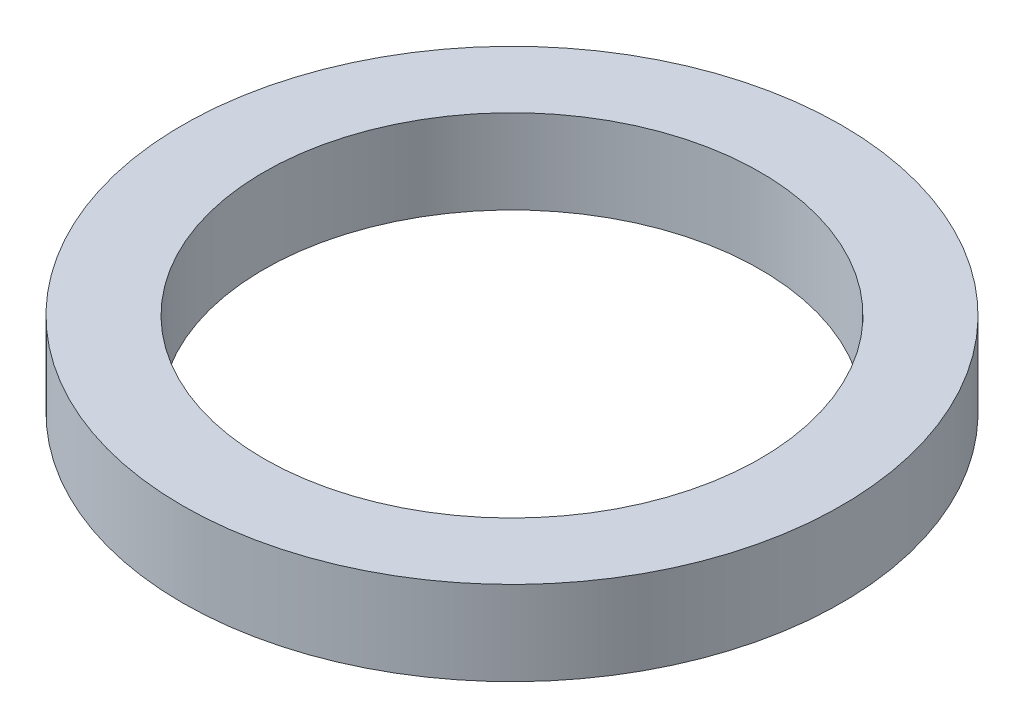
ISO-10303-21;
HEADER;
FILE_DESCRIPTION(('STEP AP214'),'2;1');
FILE_NAME('part.step','',(''),(''),'','','');
FILE_SCHEMA(('AUTOMOTIVE_DESIGN { 1 0 10303 214 1 1 1 1 }'));
ENDSEC;
DATA;
#1=APPLICATION_CONTEXT('core data for automotive mechanical design processes');
#2=APPLICATION_PROTOCOL_DEFINITION('international standard','automotive_design',2000,#1);
#3=PRODUCT_CONTEXT('',#1,'mechanical');
#4=PRODUCT('Part','Part','',(#3));
#5=PRODUCT_RELATED_PRODUCT_CATEGORY('part','',(#4));
#6=PRODUCT_DEFINITION_FORMATION('','',#4);
#7=PRODUCT_DEFINITION_CONTEXT('part definition',#1,'design');
#8=PRODUCT_DEFINITION('design','',#6,#7);
#9=PRODUCT_DEFINITION_SHAPE('','',#8);
#10=(LENGTH_UNIT() NAMED_UNIT(*) SI_UNIT(.MILLI.,.METRE.));
#11=(NAMED_UNIT(*) PLANE_ANGLE_UNIT() SI_UNIT($,.RADIAN.));
#12=(NAMED_UNIT(*) SI_UNIT($,.STERADIAN.) SOLID_ANGLE_UNIT());
#13=UNCERTAINTY_MEASURE_WITH_UNIT(LENGTH_MEASURE(1.E-05),#10,'distance_accuracy_value','');
#14=(GEOMETRIC_REPRESENTATION_CONTEXT(3) GLOBAL_UNCERTAINTY_ASSIGNED_CONTEXT((#13)) GLOBAL_UNIT_ASSIGNED_CONTEXT((#10,
#11,#12)) REPRESENTATION_CONTEXT('',''));
#15=CARTESIAN_POINT('',(0.,0.,0.));
#16=DIRECTION('',(0.,0.,1.));
#17=DIRECTION('',(1.,0.,0.));
#18=AXIS2_PLACEMENT_3D('',#15,#16,#17);
#19=CARTESIAN_POINT('',(0.,4.92,0.));
#20=DIRECTION('',(0.,1.,0.));
#21=DIRECTION('',(0.,0.,1.));
#22=AXIS2_PLACEMENT_3D('',#19,#20,#21);
#23=PLANE('',#22);
#24=CARTESIAN_POINT('',(0.,4.92,0.));
#25=DIRECTION('',(0.,1.,0.));
#26=DIRECTION('',(0.,0.,1.));
#27=AXIS2_PLACEMENT_3D('',#24,#25,#26);
#28=CIRCLE('',#27,38.505);
#29=CARTESIAN_POINT('',(0.,4.92,38.505));
#30=VERTEX_POINT('',#29);
#31=EDGE_CURVE('E10',#30,#30,#28,.T.);
#32=ORIENTED_EDGE('',*,*,#31,.T.);
#33=EDGE_LOOP('',(#32));
#34=FACE_BOUND('',#33,.T.);
#35=CARTESIAN_POINT('',(0.,4.92,0.));
#36=DIRECTION('',(0.,1.,0.));
#37=DIRECTION('',(0.,0.,1.));
#38=AXIS2_PLACEMENT_3D('',#35,#36,#37);
#39=CIRCLE('',#38,29.);
#40=CARTESIAN_POINT('',(0.,4.92,29.));
#41=VERTEX_POINT('',#40);
#42=EDGE_CURVE('E48',#41,#41,#39,.T.);
#43=ORIENTED_EDGE('',*,*,#42,.F.);
#44=EDGE_LOOP('',(#43));
#45=FACE_BOUND('',#44,.T.);
#46=ADVANCED_FACE('F37',(#34,#45),#23,.T.);
#47=CARTESIAN_POINT('',(0.,-4.92,0.));
#48=DIRECTION('',(0.,1.,0.));
#49=DIRECTION('',(0.,0.,1.));
#50=AXIS2_PLACEMENT_3D('',#47,#48,#49);
#51=PLANE('',#50);
#52=CARTESIAN_POINT('',(0.,-4.92,0.));
#53=DIRECTION('',(0.,1.,0.));
#54=DIRECTION('',(0.,0.,1.));
#55=AXIS2_PLACEMENT_3D('',#52,#53,#54);
#56=CIRCLE('',#55,38.505);
#57=CARTESIAN_POINT('',(0.,-4.92,38.505));
#58=VERTEX_POINT('',#57);
#59=EDGE_CURVE('E41',#58,#58,#56,.T.);
#60=ORIENTED_EDGE('',*,*,#59,.F.);
#61=EDGE_LOOP('',(#60));
#62=FACE_BOUND('',#61,.T.);
#63=CARTESIAN_POINT('',(0.,-4.92,0.));
#64=DIRECTION('',(0.,1.,0.));
#65=DIRECTION('',(0.,0.,1.));
#66=AXIS2_PLACEMENT_3D('',#63,#64,#65);
#67=CIRCLE('',#66,29.);
#68=CARTESIAN_POINT('',(0.,-4.92,29.));
#69=VERTEX_POINT('',#68);
#70=EDGE_CURVE('E50',#69,#69,#67,.T.);
#71=ORIENTED_EDGE('',*,*,#70,.T.);
#72=EDGE_LOOP('',(#71));
#73=FACE_BOUND('',#72,.T.);
#74=ADVANCED_FACE('F60',(#62,#73),#51,.F.);
#75=CARTESIAN_POINT('',(0.,4.92,0.));
#76=DIRECTION('',(0.,-1.,0.));
#77=DIRECTION('',(0.,0.,-1.));
#78=AXIS2_PLACEMENT_3D('',#75,#76,#77);
#79=CYLINDRICAL_SURFACE('',#78,38.505);
#80=ORIENTED_EDGE('',*,*,#31,.F.);
#81=EDGE_LOOP('',(#80));
#82=FACE_BOUND('',#81,.T.);
#83=ORIENTED_EDGE('',*,*,#59,.T.);
#84=EDGE_LOOP('',(#83));
#85=FACE_BOUND('',#84,.T.);
#86=ADVANCED_FACE('F39',(#82,#85),#79,.T.);
#87=CARTESIAN_POINT('',(0.,4.92,0.));
#88=DIRECTION('',(0.,-1.,0.));
#89=DIRECTION('',(0.,0.,-1.));
#90=AXIS2_PLACEMENT_3D('',#87,#88,#89);
#91=CYLINDRICAL_SURFACE('',#90,29.);
#92=ORIENTED_EDGE('',*,*,#42,.T.);
#93=EDGE_LOOP('',(#92));
#94=FACE_BOUND('',#93,.T.);
#95=ORIENTED_EDGE('',*,*,#70,.F.);
#96=EDGE_LOOP('',(#95));
#97=FACE_BOUND('',#96,.T.);
#98=ADVANCED_FACE('F56',(#94,#97),#91,.F.);
#99=CLOSED_SHELL('',(#46,#74,#86,#98));
#100=MANIFOLD_SOLID_BREP('B2',#99);
#101=ADVANCED_BREP_SHAPE_REPRESENTATION('',(#18,#100),#14);
#102=SHAPE_DEFINITION_REPRESENTATION(#9,#101);
ENDSEC;
END-ISO-10303-21;
